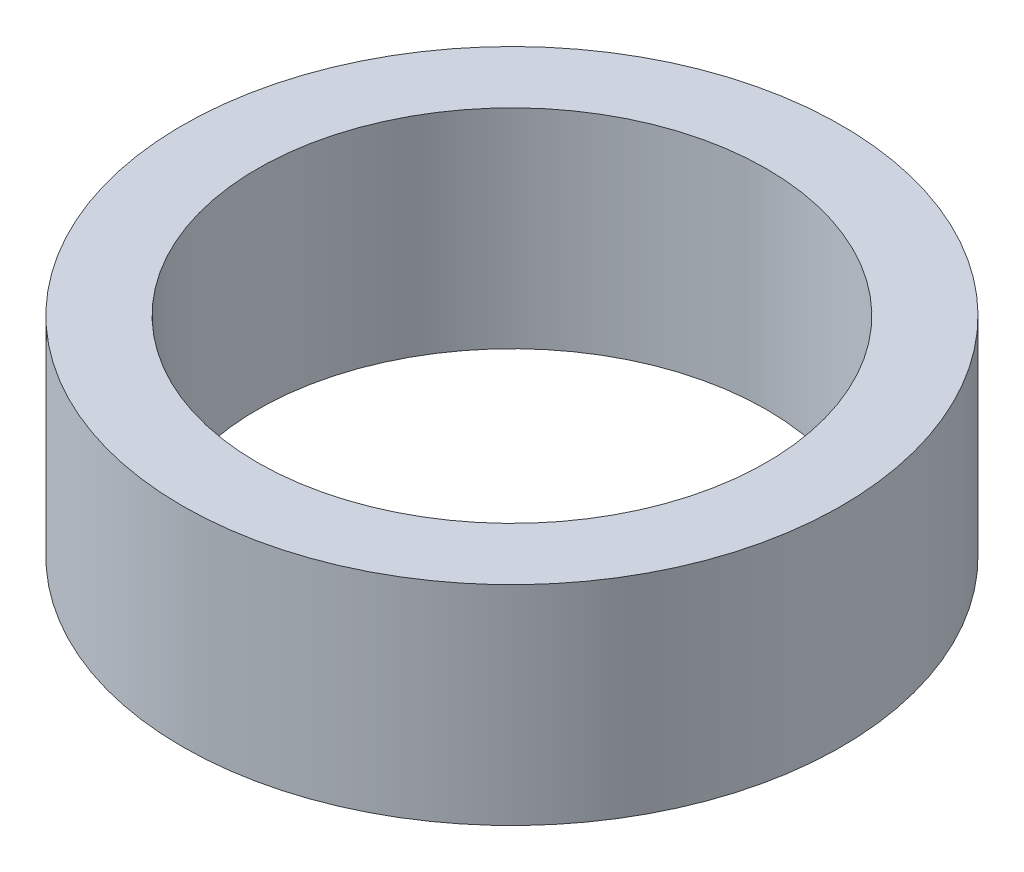
ISO-10303-21;
HEADER;
FILE_DESCRIPTION(('STEP AP214'),'2;1');
FILE_NAME('part.step','',(''),(''),'','','');
FILE_SCHEMA(('AUTOMOTIVE_DESIGN { 1 0 10303 214 1 1 1 1 }'));
ENDSEC;
DATA;
#1=APPLICATION_CONTEXT('core data for automotive mechanical design processes');
#2=APPLICATION_PROTOCOL_DEFINITION('international standard','automotive_design',2000,#1);
#3=PRODUCT_CONTEXT('',#1,'mechanical');
#4=PRODUCT('Part','Part','',(#3));
#5=PRODUCT_RELATED_PRODUCT_CATEGORY('part','',(#4));
#6=PRODUCT_DEFINITION_FORMATION('','',#4);
#7=PRODUCT_DEFINITION_CONTEXT('part definition',#1,'design');
#8=PRODUCT_DEFINITION('design','',#6,#7);
#9=PRODUCT_DEFINITION_SHAPE('','',#8);
#10=(LENGTH_UNIT() NAMED_UNIT(*) SI_UNIT(.MILLI.,.METRE.));
#11=(NAMED_UNIT(*) PLANE_ANGLE_UNIT() SI_UNIT($,.RADIAN.));
#12=(NAMED_UNIT(*) SI_UNIT($,.STERADIAN.) SOLID_ANGLE_UNIT());
#13=UNCERTAINTY_MEASURE_WITH_UNIT(LENGTH_MEASURE(1.E-05),#10,'distance_accuracy_value','');
#14=(GEOMETRIC_REPRESENTATION_CONTEXT(3) GLOBAL_UNCERTAINTY_ASSIGNED_CONTEXT((#13)) GLOBAL_UNIT_ASSIGNED_CONTEXT((#10,
#11,#12)) REPRESENTATION_CONTEXT('',''));
#15=CARTESIAN_POINT('',(0.,0.,0.));
#16=DIRECTION('',(0.,0.,1.));
#17=DIRECTION('',(1.,0.,0.));
#18=AXIS2_PLACEMENT_3D('',#15,#16,#17);
#19=CARTESIAN_POINT('',(0.,5.,0.));
#20=DIRECTION('',(0.,1.,0.));
#21=DIRECTION('',(0.,0.,1.));
#22=AXIS2_PLACEMENT_3D('',#19,#20,#21);
#23=PLANE('',#22);
#24=CARTESIAN_POINT('',(0.,5.,0.));
#25=DIRECTION('',(0.,1.,0.));
#26=DIRECTION('',(0.,0.,1.));
#27=AXIS2_PLACEMENT_3D('',#24,#25,#26);
#28=CIRCLE('',#27,7.9);
#29=CARTESIAN_POINT('',(0.,5.,7.9));
#30=VERTEX_POINT('',#29);
#31=EDGE_CURVE('E10',#30,#30,#28,.T.);
#32=ORIENTED_EDGE('',*,*,#31,.T.);
#33=EDGE_LOOP('',(#32));
#34=FACE_BOUND('',#33,.T.);
#35=CARTESIAN_POINT('',(0.,5.,0.));
#36=DIRECTION('',(0.,1.,0.));
#37=DIRECTION('',(0.,0.,1.));
#38=AXIS2_PLACEMENT_3D('',#35,#36,#37);
#39=CIRCLE('',#38,6.1);
#40=CARTESIAN_POINT('',(0.,5.,6.1));
#41=VERTEX_POINT('',#40);
#42=EDGE_CURVE('E48',#41,#41,#39,.T.);
#43=ORIENTED_EDGE('',*,*,#42,.F.);
#44=EDGE_LOOP('',(#43));
#45=FACE_BOUND('',#44,.T.);
#46=ADVANCED_FACE('F37',(#34,#45),#23,.T.);
#47=CARTESIAN_POINT('',(0.,0.,0.));
#48=DIRECTION('',(0.,1.,0.));
#49=DIRECTION('',(0.,0.,1.));
#50=AXIS2_PLACEMENT_3D('',#47,#48,#49);
#51=PLANE('',#50);
#52=CARTESIAN_POINT('',(0.,0.,0.));
#53=DIRECTION('',(0.,1.,0.));
#54=DIRECTION('',(0.,0.,1.));
#55=AXIS2_PLACEMENT_3D('',#52,#53,#54);
#56=CIRCLE('',#55,7.9);
#57=CARTESIAN_POINT('',(0.,0.,7.9));
#58=VERTEX_POINT('',#57);
#59=EDGE_CURVE('E41',#58,#58,#56,.T.);
#60=ORIENTED_EDGE('',*,*,#59,.F.);
#61=EDGE_LOOP('',(#60));
#62=FACE_BOUND('',#61,.T.);
#63=CARTESIAN_POINT('',(0.,0.,0.));
#64=DIRECTION('',(0.,1.,0.));
#65=DIRECTION('',(0.,0.,1.));
#66=AXIS2_PLACEMENT_3D('',#63,#64,#65);
#67=CIRCLE('',#66,6.1);
#68=CARTESIAN_POINT('',(0.,0.,6.1));
#69=VERTEX_POINT('',#68);
#70=EDGE_CURVE('E50',#69,#69,#67,.T.);
#71=ORIENTED_EDGE('',*,*,#70,.T.);
#72=EDGE_LOOP('',(#71));
#73=FACE_BOUND('',#72,.T.);
#74=ADVANCED_FACE('F60',(#62,#73),#51,.F.);
#75=CARTESIAN_POINT('',(0.,5.,0.));
#76=DIRECTION('',(0.,-1.,0.));
#77=DIRECTION('',(0.,0.,-1.));
#78=AXIS2_PLACEMENT_3D('',#75,#76,#77);
#79=CYLINDRICAL_SURFACE('',#78,7.9);
#80=ORIENTED_EDGE('',*,*,#31,.F.);
#81=EDGE_LOOP('',(#80));
#82=FACE_BOUND('',#81,.T.);
#83=ORIENTED_EDGE('',*,*,#59,.T.);
#84=EDGE_LOOP('',(#83));
#85=FACE_BOUND('',#84,.T.);
#86=ADVANCED_FACE('F39',(#82,#85),#79,.T.);
#87=CARTESIAN_POINT('',(0.,5.,0.));
#88=DIRECTION('',(0.,-1.,0.));
#89=DIRECTION('',(0.,0.,-1.));
#90=AXIS2_PLACEMENT_3D('',#87,#88,#89);
#91=CYLINDRICAL_SURFACE('',#90,6.1);
#92=ORIENTED_EDGE('',*,*,#42,.T.);
#93=EDGE_LOOP('',(#92));
#94=FACE_BOUND('',#93,.T.);
#95=ORIENTED_EDGE('',*,*,#70,.F.);
#96=EDGE_LOOP('',(#95));
#97=FACE_BOUND('',#96,.T.);
#98=ADVANCED_FACE('F56',(#94,#97),#91,.F.);
#99=CLOSED_SHELL('',(#46,#74,#86,#98));
#100=MANIFOLD_SOLID_BREP('B2',#99);
#101=ADVANCED_BREP_SHAPE_REPRESENTATION('',(#18,#100),#14);
#102=SHAPE_DEFINITION_REPRESENTATION(#9,#101);
ENDSEC;
END-ISO-10303-21;
